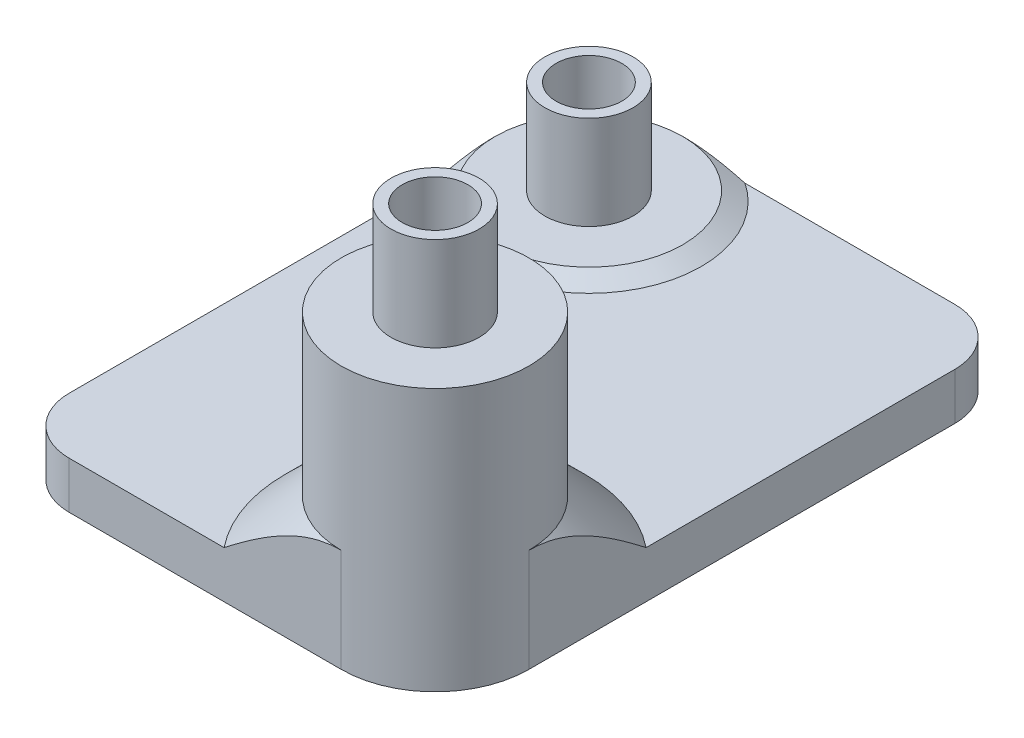
ISO-10303-21;
HEADER;
FILE_DESCRIPTION(('STEP AP214'),'2;1');
FILE_NAME('part.step','',(''),(''),'','','');
FILE_SCHEMA(('AUTOMOTIVE_DESIGN { 1 0 10303 214 1 1 1 1 }'));
ENDSEC;
DATA;
#1=APPLICATION_CONTEXT('core data for automotive mechanical design processes');
#2=APPLICATION_PROTOCOL_DEFINITION('international standard','automotive_design',2000,#1);
#3=PRODUCT_CONTEXT('',#1,'mechanical');
#4=PRODUCT('Part','Part','',(#3));
#5=PRODUCT_RELATED_PRODUCT_CATEGORY('part','',(#4));
#6=PRODUCT_DEFINITION_FORMATION('','',#4);
#7=PRODUCT_DEFINITION_CONTEXT('part definition',#1,'design');
#8=PRODUCT_DEFINITION('design','',#6,#7);
#9=PRODUCT_DEFINITION_SHAPE('','',#8);
#10=(LENGTH_UNIT() NAMED_UNIT(*) SI_UNIT(.MILLI.,.METRE.));
#11=(NAMED_UNIT(*) PLANE_ANGLE_UNIT() SI_UNIT($,.RADIAN.));
#12=(NAMED_UNIT(*) SI_UNIT($,.STERADIAN.) SOLID_ANGLE_UNIT());
#13=UNCERTAINTY_MEASURE_WITH_UNIT(LENGTH_MEASURE(1.E-05),#10,'distance_accuracy_value','');
#14=(GEOMETRIC_REPRESENTATION_CONTEXT(3) GLOBAL_UNCERTAINTY_ASSIGNED_CONTEXT((#13)) GLOBAL_UNIT_ASSIGNED_CONTEXT((#10,
#11,#12)) REPRESENTATION_CONTEXT('',''));
#15=CARTESIAN_POINT('',(0.,0.,0.));
#16=DIRECTION('',(0.,0.,1.));
#17=DIRECTION('',(1.,0.,0.));
#18=AXIS2_PLACEMENT_3D('',#15,#16,#17);
#19=CARTESIAN_POINT('',(0.,11.5,0.));
#20=DIRECTION('',(0.,1.,0.));
#21=DIRECTION('',(0.,0.,1.));
#22=AXIS2_PLACEMENT_3D('',#19,#20,#21);
#23=PLANE('',#22);
#24=CARTESIAN_POINT('',(0.,11.5,0.));
#25=DIRECTION('',(0.,1.,0.));
#26=DIRECTION('',(0.,0.,1.));
#27=AXIS2_PLACEMENT_3D('',#24,#25,#26);
#28=CIRCLE('',#27,5.);
#29=CARTESIAN_POINT('',(0.,11.5,5.));
#30=VERTEX_POINT('',#29);
#31=EDGE_CURVE('E300',#30,#30,#28,.T.);
#32=ORIENTED_EDGE('',*,*,#31,.T.);
#33=EDGE_LOOP('',(#32));
#34=FACE_BOUND('',#33,.T.);
#35=CARTESIAN_POINT('',(0.,11.5,0.));
#36=DIRECTION('',(0.,1.,0.));
#37=DIRECTION('',(0.,0.,1.));
#38=AXIS2_PLACEMENT_3D('',#35,#36,#37);
#39=CIRCLE('',#38,2.35);
#40=CARTESIAN_POINT('',(0.,11.5,2.35));
#41=VERTEX_POINT('',#40);
#42=EDGE_CURVE('E318',#41,#41,#39,.T.);
#43=ORIENTED_EDGE('',*,*,#42,.F.);
#44=EDGE_LOOP('',(#43));
#45=FACE_BOUND('',#44,.T.);
#46=ADVANCED_FACE('F43',(#34,#45),#23,.T.);
#47=CARTESIAN_POINT('',(0.,0.5,0.));
#48=DIRECTION('',(0.,1.,0.));
#49=DIRECTION('',(0.,0.,1.));
#50=AXIS2_PLACEMENT_3D('',#47,#48,#49);
#51=PLANE('',#50);
#52=CARTESIAN_POINT('',(-12.5,0.5,-20.7));
#53=DIRECTION('',(0.,1.,0.));
#54=DIRECTION('',(0.,0.,1.));
#55=AXIS2_PLACEMENT_3D('',#52,#53,#54);
#56=CIRCLE('',#55,5.);
#57=CARTESIAN_POINT('',(-12.5,0.5,-25.7));
#58=VERTEX_POINT('',#57);
#59=CARTESIAN_POINT('',(-17.5,0.5,-20.7));
#60=VERTEX_POINT('',#59);
#61=EDGE_CURVE('E179',#58,#60,#56,.T.);
#62=ORIENTED_EDGE('',*,*,#61,.T.);
#63=EDGE_CURVE('E295',#60,#58,#56,.T.);
#64=ORIENTED_EDGE('',*,*,#63,.T.);
#65=EDGE_LOOP('',(#62,#64));
#66=FACE_BOUND('',#65,.T.);
#67=CARTESIAN_POINT('',(-12.5,0.5,-20.7));
#68=DIRECTION('',(0.,1.,0.));
#69=DIRECTION('',(0.,0.,1.));
#70=AXIS2_PLACEMENT_3D('',#67,#68,#69);
#71=CIRCLE('',#70,2.35);
#72=CARTESIAN_POINT('',(-12.5,0.5,-18.35));
#73=VERTEX_POINT('',#72);
#74=EDGE_CURVE('E306',#73,#73,#71,.T.);
#75=ORIENTED_EDGE('',*,*,#74,.F.);
#76=EDGE_LOOP('',(#75));
#77=FACE_BOUND('',#76,.T.);
#78=ADVANCED_FACE('F293',(#66,#77),#51,.T.);
#79=CARTESIAN_POINT('',(0.,0.,0.));
#80=DIRECTION('',(0.,1.,0.));
#81=DIRECTION('',(0.,0.,1.));
#82=AXIS2_PLACEMENT_3D('',#79,#80,#81);
#83=PLANE('',#82);
#84=DIRECTION('',(1.,0.,0.));
#85=VECTOR('',#84,1.);
#86=CARTESIAN_POINT('',(0.,0.,5.));
#87=LINE('',#86,#85);
#88=CARTESIAN_POINT('',(-14.5,0.,5.));
#89=VERTEX_POINT('',#88);
#90=CARTESIAN_POINT('',(-6.24499799839839,0.,5.));
#91=VERTEX_POINT('',#90);
#92=EDGE_CURVE('E174',#89,#91,#87,.T.);
#93=ORIENTED_EDGE('',*,*,#92,.T.);
#94=CARTESIAN_POINT('',(0.,0.,0.));
#95=DIRECTION('',(0.,1.,0.));
#96=DIRECTION('',(0.,0.,1.));
#97=AXIS2_PLACEMENT_3D('',#94,#95,#96);
#98=CIRCLE('',#97,8.);
#99=CARTESIAN_POINT('',(5.,0.,-6.2449979983984));
#100=VERTEX_POINT('',#99);
#101=EDGE_CURVE('E276',#91,#100,#98,.F.);
#102=ORIENTED_EDGE('',*,*,#101,.T.);
#103=DIRECTION('',(0.,0.,1.));
#104=VECTOR('',#103,1.);
#105=CARTESIAN_POINT('',(5.,0.,0.));
#106=LINE('',#105,#104);
#107=CARTESIAN_POINT('',(5.,0.,-22.7));
#108=VERTEX_POINT('',#107);
#109=EDGE_CURVE('E178',#108,#100,#106,.T.);
#110=ORIENTED_EDGE('',*,*,#109,.F.);
#111=CARTESIAN_POINT('',(2.,0.,-22.7));
#112=DIRECTION('',(0.,1.,0.));
#113=DIRECTION('',(0.,0.,1.));
#114=AXIS2_PLACEMENT_3D('',#111,#112,#113);
#115=CIRCLE('',#114,3.);
#116=CARTESIAN_POINT('',(2.,0.,-25.7));
#117=VERTEX_POINT('',#116);
#118=EDGE_CURVE('E200',#108,#117,#115,.T.);
#119=ORIENTED_EDGE('',*,*,#118,.T.);
#120=DIRECTION('',(1.,0.,0.));
#121=VECTOR('',#120,1.);
#122=CARTESIAN_POINT('',(0.,0.,-25.7));
#123=LINE('',#122,#121);
#124=CARTESIAN_POINT('',(-9.18337520964459,0.,-25.7));
#125=VERTEX_POINT('',#124);
#126=EDGE_CURVE('E183',#125,#117,#123,.T.);
#127=ORIENTED_EDGE('',*,*,#126,.F.);
#128=CARTESIAN_POINT('',(-12.5,0.,-20.7));
#129=DIRECTION('',(0.,1.,0.));
#130=DIRECTION('',(0.,0.,1.));
#131=AXIS2_PLACEMENT_3D('',#128,#129,#130);
#132=CIRCLE('',#131,6.00000000000001);
#133=CARTESIAN_POINT('',(-17.5,0.,-17.3833752096446));
#134=VERTEX_POINT('',#133);
#135=EDGE_CURVE('E222',#125,#134,#132,.F.);
#136=ORIENTED_EDGE('',*,*,#135,.T.);
#137=DIRECTION('',(0.,0.,1.));
#138=VECTOR('',#137,1.);
#139=CARTESIAN_POINT('',(-17.5,0.,0.));
#140=LINE('',#139,#138);
#141=CARTESIAN_POINT('',(-17.5,0.,2.));
#142=VERTEX_POINT('',#141);
#143=EDGE_CURVE('E135',#134,#142,#140,.T.);
#144=ORIENTED_EDGE('',*,*,#143,.T.);
#145=CARTESIAN_POINT('',(-14.5,0.,2.));
#146=DIRECTION('',(0.,1.,0.));
#147=DIRECTION('',(0.,0.,1.));
#148=AXIS2_PLACEMENT_3D('',#145,#146,#147);
#149=CIRCLE('',#148,3.);
#150=EDGE_CURVE('E204',#142,#89,#149,.T.);
#151=ORIENTED_EDGE('',*,*,#150,.T.);
#152=EDGE_LOOP('',(#93,#102,#110,#119,#127,#136,#144,#151));
#153=FACE_BOUND('',#152,.T.);
#154=ADVANCED_FACE('F261',(#153),#83,.T.);
#155=CARTESIAN_POINT('',(0.,-2.5,5.));
#156=DIRECTION('',(0.,0.,1.));
#157=DIRECTION('',(1.,0.,0.));
#158=AXIS2_PLACEMENT_3D('',#155,#156,#157);
#159=PLANE('',#158);
#160=ORIENTED_EDGE('',*,*,#92,.F.);
#161=DIRECTION('',(0.,1.,0.));
#162=VECTOR('',#161,1.);
#163=CARTESIAN_POINT('',(-14.5,-2.5,5.));
#164=LINE('',#163,#162);
#165=CARTESIAN_POINT('',(-14.5,-2.5,5.));
#166=VERTEX_POINT('',#165);
#167=EDGE_CURVE('E129',#89,#166,#164,.F.);
#168=ORIENTED_EDGE('',*,*,#167,.T.);
#169=DIRECTION('',(1.,0.,0.));
#170=VECTOR('',#169,1.);
#171=CARTESIAN_POINT('',(0.,-2.5,5.));
#172=LINE('',#171,#170);
#173=CARTESIAN_POINT('',(0.,-2.5,5.));
#174=VERTEX_POINT('',#173);
#175=EDGE_CURVE('E125',#166,#174,#172,.T.);
#176=ORIENTED_EDGE('',*,*,#175,.T.);
#177=DIRECTION('',(0.,1.,0.));
#178=VECTOR('',#177,1.);
#179=CARTESIAN_POINT('',(0.,-2.5,5.));
#180=LINE('',#179,#178);
#181=CARTESIAN_POINT('',(0.,3.,5.));
#182=VERTEX_POINT('',#181);
#183=EDGE_CURVE('E72',#174,#182,#180,.T.);
#184=ORIENTED_EDGE('',*,*,#183,.T.);
#185=CARTESIAN_POINT('',(0.,3.,5.));
#186=CARTESIAN_POINT('',(-0.0768727378158429,3.00000619322757,5.));
#187=CARTESIAN_POINT('',(-0.153734047800558,2.9982262899611,5.));
#188=CARTESIAN_POINT('',(-0.307282512306506,2.99115253726289,5.));
#189=CARTESIAN_POINT('',(-0.383969693408095,2.98585926619893,5.));
#190=CARTESIAN_POINT('',(-0.613237942364165,2.9648273337264,5.));
#191=CARTESIAN_POINT('',(-0.765371607007667,2.94393602652757,5.));
#192=CARTESIAN_POINT('',(-1.06476883905343,2.88997282873731,5.));
#193=CARTESIAN_POINT('',(-1.21207129176495,2.85711114976197,5.));
#194=CARTESIAN_POINT('',(-1.50390045563061,2.78062546344547,5.));
#195=CARTESIAN_POINT('',(-1.64842579403924,2.73699627403048,5.));
#196=CARTESIAN_POINT('',(-1.94831212422469,2.63585226470975,5.));
#197=CARTESIAN_POINT('',(-2.10335323549445,2.57739758408883,5.));
#198=CARTESIAN_POINT('',(-2.40969970270665,2.45138339448191,5.));
#199=CARTESIAN_POINT('',(-2.56100399177759,2.38382132006999,5.));
#200=CARTESIAN_POINT('',(-2.86029750652253,2.24118373988699,5.));
#201=CARTESIAN_POINT('',(-3.00828106770315,2.16609643736009,5.));
#202=CARTESIAN_POINT('',(-3.30099443411867,2.00990435102025,5.));
#203=CARTESIAN_POINT('',(-3.44572463068959,1.92880029604338,5.));
#204=CARTESIAN_POINT('',(-3.73415125258334,1.76061013634598,5.));
#205=CARTESIAN_POINT('',(-3.87781048419049,1.67346054492643,5.));
#206=CARTESIAN_POINT('',(-4.16255106659086,1.49503861273544,5.));
#207=CARTESIAN_POINT('',(-4.30363221441498,1.40376594930734,5.));
#208=CARTESIAN_POINT('',(-4.5834119967247,1.21790998762968,5.));
#209=CARTESIAN_POINT('',(-4.72211260573007,1.12332965254982,5.));
#210=CARTESIAN_POINT('',(-4.99755126293115,0.931353365775675,5.));
#211=CARTESIAN_POINT('',(-5.13428927351718,0.833957360231653,5.));
#212=CARTESIAN_POINT('',(-5.35296882743809,0.675313273009056,5.));
#213=CARTESIAN_POINT('',(-5.43545019918179,0.614806725802503,5.));
#214=CARTESIAN_POINT('',(-5.59982830752324,0.493001638313403,5.));
#215=CARTESIAN_POINT('',(-5.68172503244729,0.431703082285039,5.));
#216=CARTESIAN_POINT('',(-5.92490378405781,0.248012046344972,5.));
#217=CARTESIAN_POINT('',(-6.08539544001866,0.124570874044578,5.));
#218=CARTESIAN_POINT('',(-6.24499799839844,0.,5.));
#219=B_SPLINE_CURVE_WITH_KNOTS('',3,(#185,#186,#187,#188,#189,#190,#191,#192,#193,#194,#195,
#196,#197,#198,#199,#200,#201,#202,#203,#204,#205,#206,#207,#208,#209,#210,#211,#212,#213,#214,
#215,#216,#217,#218),.UNSPECIFIED.,.F.,.F.,(4,2,2,2,2,2,2,2,2,2,2,2,2,2,2,2,4),(0.,
0.230575769394099,0.461113591001311,0.921155470867988,1.37348002310337,1.82602269129521,
2.32275244101165,2.81962240611027,3.31728383798525,3.81488508403918,4.31888171441685,
4.82291785429982,5.32651347329609,5.83011872994523,6.13699856631678,6.44388451314113,
7.05127016801216),.UNSPECIFIED.);
#220=EDGE_CURVE('E11',#182,#91,#219,.T.);
#221=ORIENTED_EDGE('',*,*,#220,.T.);
#222=EDGE_LOOP('',(#160,#168,#176,#184,#221));
#223=FACE_BOUND('',#222,.T.);
#224=ADVANCED_FACE('F127',(#223),#159,.T.);
#225=CARTESIAN_POINT('',(-17.5,-2.5,0.));
#226=DIRECTION('',(-1.,0.,0.));
#227=DIRECTION('',(0.,0.,1.));
#228=AXIS2_PLACEMENT_3D('',#225,#226,#227);
#229=PLANE('',#228);
#230=DIRECTION('',(0.,0.,1.));
#231=VECTOR('',#230,1.);
#232=CARTESIAN_POINT('',(-17.5,-2.5,0.));
#233=LINE('',#232,#231);
#234=CARTESIAN_POINT('',(-17.5,-2.5,-20.7));
#235=VERTEX_POINT('',#234);
#236=CARTESIAN_POINT('',(-17.5,-2.5,2.));
#237=VERTEX_POINT('',#236);
#238=EDGE_CURVE('E163',#235,#237,#233,.T.);
#239=ORIENTED_EDGE('',*,*,#238,.T.);
#240=DIRECTION('',(0.,1.,0.));
#241=VECTOR('',#240,1.);
#242=CARTESIAN_POINT('',(-17.5,-2.5,2.));
#243=LINE('',#242,#241);
#244=EDGE_CURVE('E191',#237,#142,#243,.T.);
#245=ORIENTED_EDGE('',*,*,#244,.T.);
#246=ORIENTED_EDGE('',*,*,#143,.F.);
#247=CARTESIAN_POINT('',(-17.5,0.,-17.3833752096446));
#248=CARTESIAN_POINT('',(-17.5,0.0373959386901139,-17.5187056429442));
#249=CARTESIAN_POINT('',(-17.5,0.0733268111299073,-17.6544359160254));
#250=CARTESIAN_POINT('',(-17.5,0.141816469205859,-17.9267782059273));
#251=CARTESIAN_POINT('',(-17.5,0.174374422636353,-18.0633904315628));
#252=CARTESIAN_POINT('',(-17.5,0.266001069255063,-18.4732405648821));
#253=CARTESIAN_POINT('',(-17.5,0.319394759955755,-18.7478069207886));
#254=CARTESIAN_POINT('',(-17.5,0.385235281251873,-19.1620896416456));
#255=CARTESIAN_POINT('',(-17.5,0.404816286851871,-19.3006924975356));
#256=CARTESIAN_POINT('',(-17.5,0.438773252062702,-19.5785386965221));
#257=CARTESIAN_POINT('',(-17.5,0.453149407949612,-19.717782015266));
#258=CARTESIAN_POINT('',(-17.5,0.476380144517934,-19.9973790502256));
#259=CARTESIAN_POINT('',(-17.5,0.485208934595754,-20.1377349252174));
#260=CARTESIAN_POINT('',(-17.5,0.497033573238086,-20.4187242797808));
#261=CARTESIAN_POINT('',(-17.5,0.500028032357996,-20.5593578174973));
#262=CARTESIAN_POINT('',(-17.5,0.500000000000007,-20.7));
#263=B_SPLINE_CURVE_WITH_KNOTS('',3,(#247,#248,#249,#250,#251,#252,#253,#254,#255,#256,#257,
#258,#259,#260,#261,#262),.UNSPECIFIED.,.F.,.F.,(4,2,2,2,2,2,2,4),(0.,0.42118272069123,
0.842469114198601,1.68094649838508,2.10080472891009,2.52064712483537,2.94242726771887,
3.36430784517658),.UNSPECIFIED.);
#264=EDGE_CURVE('E233',#134,#60,#263,.T.);
#265=ORIENTED_EDGE('',*,*,#264,.T.);
#266=DIRECTION('',(0.,1.,0.));
#267=VECTOR('',#266,1.);
#268=CARTESIAN_POINT('',(-17.5,-2.5,-20.7));
#269=LINE('',#268,#267);
#270=EDGE_CURVE('E188',#235,#60,#269,.T.);
#271=ORIENTED_EDGE('',*,*,#270,.F.);
#272=EDGE_LOOP('',(#239,#245,#246,#265,#271));
#273=FACE_BOUND('',#272,.T.);
#274=ADVANCED_FACE('F260',(#273),#229,.T.);
#275=CARTESIAN_POINT('',(-12.5,-2.5,-20.7));
#276=DIRECTION('',(0.,1.,0.));
#277=DIRECTION('',(0.,0.,1.));
#278=AXIS2_PLACEMENT_3D('',#275,#276,#277);
#279=CYLINDRICAL_SURFACE('',#278,5.);
#280=ORIENTED_EDGE('',*,*,#61,.F.);
#281=DIRECTION('',(0.,1.,0.));
#282=VECTOR('',#281,1.);
#283=CARTESIAN_POINT('',(-12.5,-2.5,-25.7));
#284=LINE('',#283,#282);
#285=CARTESIAN_POINT('',(-12.5,-2.5,-25.7));
#286=VERTEX_POINT('',#285);
#287=EDGE_CURVE('E192',#286,#58,#284,.T.);
#288=ORIENTED_EDGE('',*,*,#287,.F.);
#289=CARTESIAN_POINT('',(-12.5,-2.5,-20.7));
#290=DIRECTION('',(0.,1.,0.));
#291=DIRECTION('',(0.,0.,1.));
#292=AXIS2_PLACEMENT_3D('',#289,#290,#291);
#293=CIRCLE('',#292,5.);
#294=EDGE_CURVE('E159',#286,#235,#293,.T.);
#295=ORIENTED_EDGE('',*,*,#294,.T.);
#296=ORIENTED_EDGE('',*,*,#270,.T.);
#297=EDGE_LOOP('',(#280,#288,#295,#296));
#298=FACE_BOUND('',#297,.T.);
#299=ADVANCED_FACE('F367',(#298),#279,.T.);
#300=CARTESIAN_POINT('',(0.,-2.5,-25.7));
#301=DIRECTION('',(0.,0.,1.));
#302=DIRECTION('',(1.,0.,0.));
#303=AXIS2_PLACEMENT_3D('',#300,#301,#302);
#304=PLANE('',#303);
#305=ORIENTED_EDGE('',*,*,#287,.T.);
#306=CARTESIAN_POINT('',(-12.5,0.500000000000005,-25.7));
#307=CARTESIAN_POINT('',(-12.3593578174973,0.500028032357994,-25.7));
#308=CARTESIAN_POINT('',(-12.2187242797808,0.497033573238083,-25.7));
#309=CARTESIAN_POINT('',(-11.9377349252174,0.485208934595752,-25.7));
#310=CARTESIAN_POINT('',(-11.7973790502256,0.476380144517932,-25.7));
#311=CARTESIAN_POINT('',(-11.517782015266,0.45314940794961,-25.7));
#312=CARTESIAN_POINT('',(-11.3785386965221,0.438773252062701,-25.7));
#313=CARTESIAN_POINT('',(-11.1006924975356,0.40481628685187,-25.7));
#314=CARTESIAN_POINT('',(-10.9620896416456,0.385235281251871,-25.7));
#315=CARTESIAN_POINT('',(-10.5478069207886,0.319394759955753,-25.7));
#316=CARTESIAN_POINT('',(-10.2732405648821,0.266001069255061,-25.7));
#317=CARTESIAN_POINT('',(-9.86339043156281,0.174374422636351,-25.7));
#318=CARTESIAN_POINT('',(-9.72677820592733,0.141816469205857,-25.7));
#319=CARTESIAN_POINT('',(-9.45443591602545,0.0733268111299063,-25.7));
#320=CARTESIAN_POINT('',(-9.31870564294425,0.0373959386901131,-25.7));
#321=CARTESIAN_POINT('',(-9.18337520964459,0.,-25.7));
#322=B_SPLINE_CURVE_WITH_KNOTS('',3,(#306,#307,#308,#309,#310,#311,#312,#313,#314,#315,#316,
#317,#318,#319,#320,#321),.UNSPECIFIED.,.F.,.F.,(4,2,2,2,2,2,2,4),(0.,0.421880577457705,
0.843660720341197,1.26350311626648,1.6833613467915,2.52183873097797,2.94312512448534,
3.36430784517657),.UNSPECIFIED.);
#323=EDGE_CURVE('E225',#58,#125,#322,.T.);
#324=ORIENTED_EDGE('',*,*,#323,.T.);
#325=ORIENTED_EDGE('',*,*,#126,.T.);
#326=DIRECTION('',(0.,1.,0.));
#327=VECTOR('',#326,1.);
#328=CARTESIAN_POINT('',(2.,-2.5,-25.7));
#329=LINE('',#328,#327);
#330=CARTESIAN_POINT('',(2.,-2.5,-25.7));
#331=VERTEX_POINT('',#330);
#332=EDGE_CURVE('E219',#117,#331,#329,.F.);
#333=ORIENTED_EDGE('',*,*,#332,.T.);
#334=DIRECTION('',(1.,0.,0.));
#335=VECTOR('',#334,1.);
#336=CARTESIAN_POINT('',(0.,-2.5,-25.7));
#337=LINE('',#336,#335);
#338=EDGE_CURVE('E152',#286,#331,#337,.T.);
#339=ORIENTED_EDGE('',*,*,#338,.F.);
#340=EDGE_LOOP('',(#305,#324,#325,#333,#339));
#341=FACE_BOUND('',#340,.T.);
#342=ADVANCED_FACE('F240',(#341),#304,.F.);
#343=CARTESIAN_POINT('',(5.,-2.5,0.));
#344=DIRECTION('',(-1.,0.,0.));
#345=DIRECTION('',(0.,0.,1.));
#346=AXIS2_PLACEMENT_3D('',#343,#344,#345);
#347=PLANE('',#346);
#348=DIRECTION('',(0.,0.,1.));
#349=VECTOR('',#348,1.);
#350=CARTESIAN_POINT('',(5.,-2.5,0.));
#351=LINE('',#350,#349);
#352=CARTESIAN_POINT('',(5.,-2.5,-22.7));
#353=VERTEX_POINT('',#352);
#354=CARTESIAN_POINT('',(5.,-2.5,0.));
#355=VERTEX_POINT('',#354);
#356=EDGE_CURVE('E148',#353,#355,#351,.T.);
#357=ORIENTED_EDGE('',*,*,#356,.F.);
#358=DIRECTION('',(0.,1.,0.));
#359=VECTOR('',#358,1.);
#360=CARTESIAN_POINT('',(5.,-2.5,-22.7));
#361=LINE('',#360,#359);
#362=EDGE_CURVE('E215',#353,#108,#361,.T.);
#363=ORIENTED_EDGE('',*,*,#362,.T.);
#364=ORIENTED_EDGE('',*,*,#109,.T.);
#365=CARTESIAN_POINT('',(5.,0.,-6.2449979983984));
#366=CARTESIAN_POINT('',(5.,0.112449126626693,-6.10091980001845));
#367=CARTESIAN_POINT('',(5.,0.223984623871432,-5.95611850221913));
#368=CARTESIAN_POINT('',(5.,0.444826174553415,-5.66478345869933));
#369=CARTESIAN_POINT('',(5.,0.5541317956835,-5.5182493855818));
#370=CARTESIAN_POINT('',(5.,0.770706986919959,-5.22234449390284));
#371=CARTESIAN_POINT('',(5.,0.877960675089213,-5.07296201804575));
#372=CARTESIAN_POINT('',(5.,1.08917714752922,-4.77189556807964));
#373=CARTESIAN_POINT('',(5.,1.19314012237365,-4.62021172800393));
#374=CARTESIAN_POINT('',(5.,1.40188682745289,-4.30690048445461));
#375=CARTESIAN_POINT('',(5.,1.50647563735224,-4.14514267327683));
#376=CARTESIAN_POINT('',(5.,1.71016690603217,-3.81816241103209));
#377=CARTESIAN_POINT('',(5.,1.80926866128314,-3.65293951941278));
#378=CARTESIAN_POINT('',(5.,2.00030726065611,-3.31889232635439));
#379=CARTESIAN_POINT('',(5.,2.09226039955217,-3.15007740362732));
#380=CARTESIAN_POINT('',(5.,2.26736352882836,-2.80797220124425));
#381=CARTESIAN_POINT('',(5.,2.35051662774197,-2.63468352898764));
#382=CARTESIAN_POINT('',(5.,2.49793867043852,-2.30061771670834));
#383=CARTESIAN_POINT('',(5.,2.56326323974317,-2.14031023459282));
#384=CARTESIAN_POINT('',(5.,2.68274793173828,-1.81547991764176));
#385=CARTESIAN_POINT('',(5.,2.73690490530466,-1.65095590846188));
#386=CARTESIAN_POINT('',(5.,2.83110482287787,-1.31997408415388));
#387=CARTESIAN_POINT('',(5.,2.87130736501103,-1.1535622655587));
#388=CARTESIAN_POINT('',(5.,2.93623004013644,-0.817806264991214));
#389=CARTESIAN_POINT('',(5.,2.96096363921182,-0.648464765738567));
#390=CARTESIAN_POINT('',(5.,2.98472910980497,-0.399007426203672));
#391=CARTESIAN_POINT('',(5.,2.99043310948407,-0.319489497682278));
#392=CARTESIAN_POINT('',(5.,2.99807865076424,-0.159986182212051));
#393=CARTESIAN_POINT('',(5.,3.00000655955533,-0.0800001433540809));
#394=CARTESIAN_POINT('',(5.,3.,0.));
#395=B_SPLINE_CURVE_WITH_KNOTS('',3,(#365,#366,#367,#368,#369,#370,#371,#372,#373,#374,#375,
#376,#377,#378,#379,#380,#381,#382,#383,#384,#385,#386,#387,#388,#389,#390,#391,#392,#393,#394),
.UNSPECIFIED.,.F.,.F.,(4,2,2,2,2,2,2,2,2,2,2,2,2,2,4),(0.,0.548305420875448,1.09671615072987,
1.6483731010047,2.19999804473414,2.77778492105724,3.35564570830871,3.93214813261274,
4.50844622816863,5.0274301027493,5.54656012484632,6.05954040903423,6.57207350782476,
6.81116211636623,7.05111232625962),.UNSPECIFIED.);
#396=CARTESIAN_POINT('',(5.,3.,0.));
#397=VERTEX_POINT('',#396);
#398=EDGE_CURVE('E58',#100,#397,#395,.T.);
#399=ORIENTED_EDGE('',*,*,#398,.T.);
#400=DIRECTION('',(0.,1.,0.));
#401=VECTOR('',#400,1.);
#402=CARTESIAN_POINT('',(5.,-2.5,0.));
#403=LINE('',#402,#401);
#404=EDGE_CURVE('E65',#355,#397,#403,.T.);
#405=ORIENTED_EDGE('',*,*,#404,.F.);
#406=EDGE_LOOP('',(#357,#363,#364,#399,#405));
#407=FACE_BOUND('',#406,.T.);
#408=ADVANCED_FACE('F265',(#407),#347,.F.);
#409=CARTESIAN_POINT('',(-12.5,-2.5,-20.7));
#410=DIRECTION('',(0.,1.,0.));
#411=DIRECTION('',(0.,0.,1.));
#412=AXIS2_PLACEMENT_3D('',#409,#410,#411);
#413=CYLINDRICAL_SURFACE('',#412,1.75);
#414=CARTESIAN_POINT('',(-12.5,-2.5,-20.7));
#415=DIRECTION('',(0.,1.,0.));
#416=DIRECTION('',(0.,0.,1.));
#417=AXIS2_PLACEMENT_3D('',#414,#415,#416);
#418=CIRCLE('',#417,1.75);
#419=CARTESIAN_POINT('',(-12.5,-2.5,-18.95));
#420=VERTEX_POINT('',#419);
#421=EDGE_CURVE('E167',#420,#420,#418,.T.);
#422=ORIENTED_EDGE('',*,*,#421,.F.);
#423=EDGE_LOOP('',(#422));
#424=FACE_BOUND('',#423,.T.);
#425=CARTESIAN_POINT('',(-12.5,5.5,-20.7));
#426=DIRECTION('',(0.,1.,0.));
#427=DIRECTION('',(0.,0.,1.));
#428=AXIS2_PLACEMENT_3D('',#425,#426,#427);
#429=CIRCLE('',#428,1.75);
#430=CARTESIAN_POINT('',(-12.5,5.5,-18.95));
#431=VERTEX_POINT('',#430);
#432=EDGE_CURVE('E310',#431,#431,#429,.T.);
#433=ORIENTED_EDGE('',*,*,#432,.T.);
#434=EDGE_LOOP('',(#433));
#435=FACE_BOUND('',#434,.T.);
#436=ADVANCED_FACE('F264',(#424,#435),#413,.F.);
#437=CARTESIAN_POINT('',(0.,-2.5,0.));
#438=DIRECTION('',(0.,1.,0.));
#439=DIRECTION('',(0.,0.,1.));
#440=AXIS2_PLACEMENT_3D('',#437,#438,#439);
#441=CYLINDRICAL_SURFACE('',#440,5.);
#442=ORIENTED_EDGE('',*,*,#404,.T.);
#443=CARTESIAN_POINT('',(0.,3.,0.));
#444=DIRECTION('',(0.,1.,0.));
#445=DIRECTION('',(0.,0.,1.));
#446=AXIS2_PLACEMENT_3D('',#443,#444,#445);
#447=CIRCLE('',#446,5.);
#448=EDGE_CURVE('E140',#397,#182,#447,.T.);
#449=ORIENTED_EDGE('',*,*,#448,.T.);
#450=ORIENTED_EDGE('',*,*,#183,.F.);
#451=CARTESIAN_POINT('',(0.,-2.5,0.));
#452=DIRECTION('',(0.,1.,0.));
#453=DIRECTION('',(0.,0.,1.));
#454=AXIS2_PLACEMENT_3D('',#451,#452,#453);
#455=CIRCLE('',#454,5.);
#456=EDGE_CURVE('E134',#174,#355,#455,.T.);
#457=ORIENTED_EDGE('',*,*,#456,.T.);
#458=EDGE_LOOP('',(#442,#449,#450,#457));
#459=FACE_BOUND('',#458,.T.);
#460=ORIENTED_EDGE('',*,*,#31,.F.);
#461=EDGE_LOOP('',(#460));
#462=FACE_BOUND('',#461,.T.);
#463=ADVANCED_FACE('F137',(#459,#462),#441,.T.);
#464=CARTESIAN_POINT('',(0.,-2.5,0.));
#465=DIRECTION('',(0.,1.,0.));
#466=DIRECTION('',(0.,0.,1.));
#467=AXIS2_PLACEMENT_3D('',#464,#465,#466);
#468=CYLINDRICAL_SURFACE('',#467,1.75);
#469=CARTESIAN_POINT('',(0.,-2.5,0.));
#470=DIRECTION('',(0.,1.,0.));
#471=DIRECTION('',(0.,0.,1.));
#472=AXIS2_PLACEMENT_3D('',#469,#470,#471);
#473=CIRCLE('',#472,1.75);
#474=CARTESIAN_POINT('',(0.,-2.5,1.75));
#475=VERTEX_POINT('',#474);
#476=EDGE_CURVE('E143',#475,#475,#473,.T.);
#477=ORIENTED_EDGE('',*,*,#476,.F.);
#478=EDGE_LOOP('',(#477));
#479=FACE_BOUND('',#478,.T.);
#480=CARTESIAN_POINT('',(0.,16.5,0.));
#481=DIRECTION('',(0.,1.,0.));
#482=DIRECTION('',(0.,0.,1.));
#483=AXIS2_PLACEMENT_3D('',#480,#481,#482);
#484=CIRCLE('',#483,1.75);
#485=CARTESIAN_POINT('',(0.,16.5,1.75));
#486=VERTEX_POINT('',#485);
#487=EDGE_CURVE('E322',#486,#486,#484,.T.);
#488=ORIENTED_EDGE('',*,*,#487,.T.);
#489=EDGE_LOOP('',(#488));
#490=FACE_BOUND('',#489,.T.);
#491=ADVANCED_FACE('F263',(#479,#490),#468,.F.);
#492=CARTESIAN_POINT('',(0.,-2.5,0.));
#493=DIRECTION('',(0.,1.,0.));
#494=DIRECTION('',(0.,0.,1.));
#495=AXIS2_PLACEMENT_3D('',#492,#493,#494);
#496=PLANE('',#495);
#497=ORIENTED_EDGE('',*,*,#175,.F.);
#498=CARTESIAN_POINT('',(-14.5,-2.5,2.));
#499=DIRECTION('',(0.,1.,0.));
#500=DIRECTION('',(0.,0.,1.));
#501=AXIS2_PLACEMENT_3D('',#498,#499,#500);
#502=CIRCLE('',#501,3.);
#503=EDGE_CURVE('E212',#166,#237,#502,.F.);
#504=ORIENTED_EDGE('',*,*,#503,.T.);
#505=ORIENTED_EDGE('',*,*,#238,.F.);
#506=ORIENTED_EDGE('',*,*,#294,.F.);
#507=ORIENTED_EDGE('',*,*,#338,.T.);
#508=CARTESIAN_POINT('',(2.,-2.5,-22.7));
#509=DIRECTION('',(0.,1.,0.));
#510=DIRECTION('',(0.,0.,1.));
#511=AXIS2_PLACEMENT_3D('',#508,#509,#510);
#512=CIRCLE('',#511,3.);
#513=EDGE_CURVE('E209',#331,#353,#512,.F.);
#514=ORIENTED_EDGE('',*,*,#513,.T.);
#515=ORIENTED_EDGE('',*,*,#356,.T.);
#516=ORIENTED_EDGE('',*,*,#456,.F.);
#517=EDGE_LOOP('',(#497,#504,#505,#506,#507,#514,#515,#516));
#518=FACE_BOUND('',#517,.T.);
#519=ORIENTED_EDGE('',*,*,#421,.T.);
#520=EDGE_LOOP('',(#519));
#521=FACE_BOUND('',#520,.T.);
#522=ORIENTED_EDGE('',*,*,#476,.T.);
#523=EDGE_LOOP('',(#522));
#524=FACE_BOUND('',#523,.T.);
#525=ADVANCED_FACE('F145',(#518,#521,#524),#496,.F.);
#526=CARTESIAN_POINT('',(-14.5,-2.5,2.));
#527=DIRECTION('',(0.,1.,0.));
#528=DIRECTION('',(0.,0.,1.));
#529=AXIS2_PLACEMENT_3D('',#526,#527,#528);
#530=CYLINDRICAL_SURFACE('',#529,3.);
#531=ORIENTED_EDGE('',*,*,#503,.F.);
#532=ORIENTED_EDGE('',*,*,#167,.F.);
#533=ORIENTED_EDGE('',*,*,#150,.F.);
#534=ORIENTED_EDGE('',*,*,#244,.F.);
#535=EDGE_LOOP('',(#531,#532,#533,#534));
#536=FACE_BOUND('',#535,.T.);
#537=ADVANCED_FACE('F253',(#536),#530,.T.);
#538=CARTESIAN_POINT('',(2.,-2.5,-22.7));
#539=DIRECTION('',(0.,1.,0.));
#540=DIRECTION('',(0.,0.,1.));
#541=AXIS2_PLACEMENT_3D('',#538,#539,#540);
#542=CYLINDRICAL_SURFACE('',#541,3.);
#543=ORIENTED_EDGE('',*,*,#513,.F.);
#544=ORIENTED_EDGE('',*,*,#332,.F.);
#545=ORIENTED_EDGE('',*,*,#118,.F.);
#546=ORIENTED_EDGE('',*,*,#362,.F.);
#547=EDGE_LOOP('',(#543,#544,#545,#546));
#548=FACE_BOUND('',#547,.T.);
#549=ADVANCED_FACE('F248',(#548),#542,.T.);
#550=CARTESIAN_POINT('',(-12.5,0.500000000000005,-20.7));
#551=DIRECTION('',(0.,-1.,0.));
#552=DIRECTION('',(0.,0.,-1.));
#553=AXIS2_PLACEMENT_3D('',#550,#551,#552);
#554=CONICAL_SURFACE('',#553,5.,1.10714871779409);
#555=ORIENTED_EDGE('',*,*,#264,.F.);
#556=ORIENTED_EDGE('',*,*,#135,.F.);
#557=ORIENTED_EDGE('',*,*,#323,.F.);
#558=ORIENTED_EDGE('',*,*,#63,.F.);
#559=EDGE_LOOP('',(#555,#556,#557,#558));
#560=FACE_BOUND('',#559,.T.);
#561=ADVANCED_FACE('F244',(#560),#554,.T.);
#562=CARTESIAN_POINT('',(0.,0.,0.));
#563=DIRECTION('',(0.,-1.,0.));
#564=DIRECTION('',(0.,0.,-1.));
#565=AXIS2_PLACEMENT_3D('',#562,#563,#564);
#566=CONICAL_SURFACE('',#565,8.,0.785398163397448);
#567=ORIENTED_EDGE('',*,*,#220,.F.);
#568=ORIENTED_EDGE('',*,*,#448,.F.);
#569=ORIENTED_EDGE('',*,*,#398,.F.);
#570=ORIENTED_EDGE('',*,*,#101,.F.);
#571=EDGE_LOOP('',(#567,#568,#569,#570));
#572=FACE_BOUND('',#571,.T.);
#573=ADVANCED_FACE('F45',(#572),#566,.T.);
#574=CARTESIAN_POINT('',(-12.5,5.5,-20.7));
#575=DIRECTION('',(0.,1.,0.));
#576=DIRECTION('',(0.,0.,1.));
#577=AXIS2_PLACEMENT_3D('',#574,#575,#576);
#578=PLANE('',#577);
#579=CARTESIAN_POINT('',(-12.5,5.5,-20.7));
#580=DIRECTION('',(0.,1.,0.));
#581=DIRECTION('',(0.,0.,1.));
#582=AXIS2_PLACEMENT_3D('',#579,#580,#581);
#583=CIRCLE('',#582,2.35);
#584=CARTESIAN_POINT('',(-12.5,5.5,-18.35));
#585=VERTEX_POINT('',#584);
#586=EDGE_CURVE('E303',#585,#585,#583,.T.);
#587=ORIENTED_EDGE('',*,*,#586,.T.);
#588=EDGE_LOOP('',(#587));
#589=FACE_BOUND('',#588,.T.);
#590=ORIENTED_EDGE('',*,*,#432,.F.);
#591=EDGE_LOOP('',(#590));
#592=FACE_BOUND('',#591,.T.);
#593=ADVANCED_FACE('F343',(#589,#592),#578,.T.);
#594=CARTESIAN_POINT('',(-12.5,5.5,-20.7));
#595=DIRECTION('',(0.,-1.,0.));
#596=DIRECTION('',(0.,0.,-1.));
#597=AXIS2_PLACEMENT_3D('',#594,#595,#596);
#598=CYLINDRICAL_SURFACE('',#597,2.35);
#599=ORIENTED_EDGE('',*,*,#586,.F.);
#600=EDGE_LOOP('',(#599));
#601=FACE_BOUND('',#600,.T.);
#602=ORIENTED_EDGE('',*,*,#74,.T.);
#603=EDGE_LOOP('',(#602));
#604=FACE_BOUND('',#603,.T.);
#605=ADVANCED_FACE('F334',(#601,#604),#598,.T.);
#606=CARTESIAN_POINT('',(0.,16.5,0.));
#607=DIRECTION('',(0.,1.,0.));
#608=DIRECTION('',(0.,0.,1.));
#609=AXIS2_PLACEMENT_3D('',#606,#607,#608);
#610=PLANE('',#609);
#611=CARTESIAN_POINT('',(0.,16.5,0.));
#612=DIRECTION('',(0.,1.,0.));
#613=DIRECTION('',(0.,0.,1.));
#614=AXIS2_PLACEMENT_3D('',#611,#612,#613);
#615=CIRCLE('',#614,2.35);
#616=CARTESIAN_POINT('',(0.,16.5,2.35));
#617=VERTEX_POINT('',#616);
#618=EDGE_CURVE('E317',#617,#617,#615,.T.);
#619=ORIENTED_EDGE('',*,*,#618,.T.);
#620=EDGE_LOOP('',(#619));
#621=FACE_BOUND('',#620,.T.);
#622=ORIENTED_EDGE('',*,*,#487,.F.);
#623=EDGE_LOOP('',(#622));
#624=FACE_BOUND('',#623,.T.);
#625=ADVANCED_FACE('F331',(#621,#624),#610,.T.);
#626=CARTESIAN_POINT('',(0.,16.5,0.));
#627=DIRECTION('',(0.,-1.,0.));
#628=DIRECTION('',(0.,0.,-1.));
#629=AXIS2_PLACEMENT_3D('',#626,#627,#628);
#630=CYLINDRICAL_SURFACE('',#629,2.35);
#631=ORIENTED_EDGE('',*,*,#618,.F.);
#632=EDGE_LOOP('',(#631));
#633=FACE_BOUND('',#632,.T.);
#634=ORIENTED_EDGE('',*,*,#42,.T.);
#635=EDGE_LOOP('',(#634));
#636=FACE_BOUND('',#635,.T.);
#637=ADVANCED_FACE('F333',(#633,#636),#630,.T.);
#638=CLOSED_SHELL('',(#46,#78,#154,#224,#274,#299,#342,#408,#436,#463,#491,#525,#537,#549,#561,
#573,#593,#605,#625,#637));
#639=MANIFOLD_SOLID_BREP('B2',#638);
#640=ADVANCED_BREP_SHAPE_REPRESENTATION('',(#18,#639),#14);
#641=SHAPE_DEFINITION_REPRESENTATION(#9,#640);
ENDSEC;
END-ISO-10303-21;
